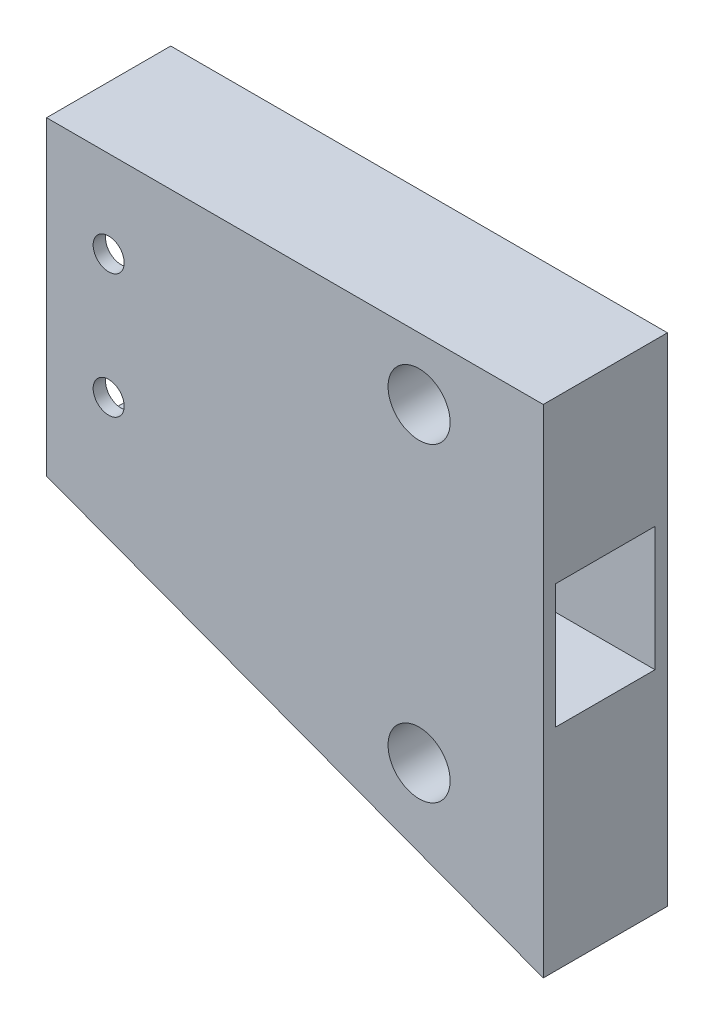
ISO-10303-21;
HEADER;
FILE_DESCRIPTION(('STEP AP214'),'2;1');
FILE_NAME('part.step','',(''),(''),'','','');
FILE_SCHEMA(('AUTOMOTIVE_DESIGN { 1 0 10303 214 1 1 1 1 }'));
ENDSEC;
DATA;
#1=APPLICATION_CONTEXT('core data for automotive mechanical design processes');
#2=APPLICATION_PROTOCOL_DEFINITION('international standard','automotive_design',2000,#1);
#3=PRODUCT_CONTEXT('',#1,'mechanical');
#4=PRODUCT('Part','Part','',(#3));
#5=PRODUCT_RELATED_PRODUCT_CATEGORY('part','',(#4));
#6=PRODUCT_DEFINITION_FORMATION('','',#4);
#7=PRODUCT_DEFINITION_CONTEXT('part definition',#1,'design');
#8=PRODUCT_DEFINITION('design','',#6,#7);
#9=PRODUCT_DEFINITION_SHAPE('','',#8);
#10=(LENGTH_UNIT() NAMED_UNIT(*) SI_UNIT(.MILLI.,.METRE.));
#11=(NAMED_UNIT(*) PLANE_ANGLE_UNIT() SI_UNIT($,.RADIAN.));
#12=(NAMED_UNIT(*) SI_UNIT($,.STERADIAN.) SOLID_ANGLE_UNIT());
#13=UNCERTAINTY_MEASURE_WITH_UNIT(LENGTH_MEASURE(1.E-05),#10,'distance_accuracy_value','');
#14=(GEOMETRIC_REPRESENTATION_CONTEXT(3) GLOBAL_UNCERTAINTY_ASSIGNED_CONTEXT((#13)) GLOBAL_UNIT_ASSIGNED_CONTEXT((#10,
#11,#12)) REPRESENTATION_CONTEXT('',''));
#15=CARTESIAN_POINT('',(0.,0.,0.));
#16=DIRECTION('',(0.,0.,1.));
#17=DIRECTION('',(1.,0.,0.));
#18=AXIS2_PLACEMENT_3D('',#15,#16,#17);
#19=CARTESIAN_POINT('',(0.,25.,10.));
#20=DIRECTION('',(1.,0.,0.));
#21=DIRECTION('',(0.,0.,-1.));
#22=AXIS2_PLACEMENT_3D('',#19,#20,#21);
#23=PLANE('',#22);
#24=DIRECTION('',(0.,0.,1.));
#25=VECTOR('',#24,1.);
#26=CARTESIAN_POINT('',(0.,2.,1.));
#27=LINE('',#26,#25);
#28=CARTESIAN_POINT('',(0.,2.,1.));
#29=VERTEX_POINT('',#28);
#30=CARTESIAN_POINT('',(0.,2.,9.));
#31=VERTEX_POINT('',#30);
#32=EDGE_CURVE('E173',#29,#31,#27,.T.);
#33=ORIENTED_EDGE('',*,*,#32,.F.);
#34=DIRECTION('',(0.,-1.,0.));
#35=VECTOR('',#34,1.);
#36=CARTESIAN_POINT('',(0.,22.,1.));
#37=LINE('',#36,#35);
#38=CARTESIAN_POINT('',(0.,22.,1.));
#39=VERTEX_POINT('',#38);
#40=EDGE_CURVE('E126',#39,#29,#37,.T.);
#41=ORIENTED_EDGE('',*,*,#40,.F.);
#42=DIRECTION('',(0.,0.,-1.));
#43=VECTOR('',#42,1.);
#44=CARTESIAN_POINT('',(0.,22.,1.));
#45=LINE('',#44,#43);
#46=CARTESIAN_POINT('',(0.,22.,9.));
#47=VERTEX_POINT('',#46);
#48=EDGE_CURVE('E165',#47,#39,#45,.T.);
#49=ORIENTED_EDGE('',*,*,#48,.F.);
#50=DIRECTION('',(0.,1.,0.));
#51=VECTOR('',#50,1.);
#52=CARTESIAN_POINT('',(0.,22.,9.));
#53=LINE('',#52,#51);
#54=EDGE_CURVE('E176',#31,#47,#53,.T.);
#55=ORIENTED_EDGE('',*,*,#54,.F.);
#56=EDGE_LOOP('',(#33,#41,#49,#55));
#57=FACE_BOUND('',#56,.T.);
#58=DIRECTION('',(0.,-1.,0.));
#59=VECTOR('',#58,1.);
#60=CARTESIAN_POINT('',(0.,25.,0.));
#61=LINE('',#60,#59);
#62=CARTESIAN_POINT('',(0.,25.,0.));
#63=VERTEX_POINT('',#62);
#64=CARTESIAN_POINT('',(0.,0.,0.));
#65=VERTEX_POINT('',#64);
#66=EDGE_CURVE('E186',#63,#65,#61,.T.);
#67=ORIENTED_EDGE('',*,*,#66,.T.);
#68=DIRECTION('',(0.,0.,-1.));
#69=VECTOR('',#68,1.);
#70=CARTESIAN_POINT('',(0.,0.,10.));
#71=LINE('',#70,#69);
#72=CARTESIAN_POINT('',(0.,0.,10.));
#73=VERTEX_POINT('',#72);
#74=EDGE_CURVE('E11',#73,#65,#71,.T.);
#75=ORIENTED_EDGE('',*,*,#74,.F.);
#76=DIRECTION('',(0.,-1.,0.));
#77=VECTOR('',#76,1.);
#78=CARTESIAN_POINT('',(0.,25.,10.));
#79=LINE('',#78,#77);
#80=CARTESIAN_POINT('',(0.,25.,10.));
#81=VERTEX_POINT('',#80);
#82=EDGE_CURVE('E192',#81,#73,#79,.T.);
#83=ORIENTED_EDGE('',*,*,#82,.F.);
#84=DIRECTION('',(0.,0.,-1.));
#85=VECTOR('',#84,1.);
#86=CARTESIAN_POINT('',(0.,25.,10.));
#87=LINE('',#86,#85);
#88=EDGE_CURVE('E206',#81,#63,#87,.T.);
#89=ORIENTED_EDGE('',*,*,#88,.T.);
#90=EDGE_LOOP('',(#67,#75,#83,#89));
#91=FACE_BOUND('',#90,.T.);
#92=ADVANCED_FACE('F39',(#57,#91),#23,.F.);
#93=CARTESIAN_POINT('',(0.,0.,10.));
#94=DIRECTION('',(0.351123441588392,0.936329177569045,0.));
#95=DIRECTION('',(-0.936329177569045,0.351123441588392,0.));
#96=AXIS2_PLACEMENT_3D('',#93,#94,#95);
#97=PLANE('',#96);
#98=DIRECTION('',(0.936329177569045,-0.351123441588392,0.));
#99=VECTOR('',#98,1.);
#100=CARTESIAN_POINT('',(0.,0.,0.));
#101=LINE('',#100,#99);
#102=CARTESIAN_POINT('',(40.,-15.,0.));
#103=VERTEX_POINT('',#102);
#104=EDGE_CURVE('E210',#65,#103,#101,.T.);
#105=ORIENTED_EDGE('',*,*,#104,.T.);
#106=DIRECTION('',(0.,0.,-1.));
#107=VECTOR('',#106,1.);
#108=CARTESIAN_POINT('',(40.,-15.,10.));
#109=LINE('',#108,#107);
#110=CARTESIAN_POINT('',(40.,-15.,10.));
#111=VERTEX_POINT('',#110);
#112=EDGE_CURVE('E48',#111,#103,#109,.T.);
#113=ORIENTED_EDGE('',*,*,#112,.F.);
#114=DIRECTION('',(0.936329177569045,-0.351123441588392,0.));
#115=VECTOR('',#114,1.);
#116=CARTESIAN_POINT('',(0.,0.,10.));
#117=LINE('',#116,#115);
#118=EDGE_CURVE('E196',#73,#111,#117,.T.);
#119=ORIENTED_EDGE('',*,*,#118,.F.);
#120=ORIENTED_EDGE('',*,*,#74,.T.);
#121=EDGE_LOOP('',(#105,#113,#119,#120));
#122=FACE_BOUND('',#121,.T.);
#123=ADVANCED_FACE('F291',(#122),#97,.F.);
#124=CARTESIAN_POINT('',(40.,-15.,10.));
#125=DIRECTION('',(-1.,0.,0.));
#126=DIRECTION('',(0.,0.,1.));
#127=AXIS2_PLACEMENT_3D('',#124,#125,#126);
#128=PLANE('',#127);
#129=DIRECTION('',(0.,0.,-1.));
#130=VECTOR('',#129,1.);
#131=CARTESIAN_POINT('',(40.,12.,1.));
#132=LINE('',#131,#130);
#133=CARTESIAN_POINT('',(40.,12.,9.));
#134=VERTEX_POINT('',#133);
#135=CARTESIAN_POINT('',(40.,12.,1.));
#136=VERTEX_POINT('',#135);
#137=EDGE_CURVE('E141',#134,#136,#132,.T.);
#138=ORIENTED_EDGE('',*,*,#137,.T.);
#139=DIRECTION('',(0.,-1.,0.));
#140=VECTOR('',#139,1.);
#141=CARTESIAN_POINT('',(40.,2.,1.));
#142=LINE('',#141,#140);
#143=CARTESIAN_POINT('',(40.,2.,1.));
#144=VERTEX_POINT('',#143);
#145=EDGE_CURVE('E123',#136,#144,#142,.T.);
#146=ORIENTED_EDGE('',*,*,#145,.T.);
#147=DIRECTION('',(0.,0.,1.));
#148=VECTOR('',#147,1.);
#149=CARTESIAN_POINT('',(40.,2.,1.));
#150=LINE('',#149,#148);
#151=CARTESIAN_POINT('',(40.,2.,9.));
#152=VERTEX_POINT('',#151);
#153=EDGE_CURVE('E132',#144,#152,#150,.T.);
#154=ORIENTED_EDGE('',*,*,#153,.T.);
#155=DIRECTION('',(0.,1.,0.));
#156=VECTOR('',#155,1.);
#157=CARTESIAN_POINT('',(40.,2.,9.));
#158=LINE('',#157,#156);
#159=EDGE_CURVE('E137',#152,#134,#158,.T.);
#160=ORIENTED_EDGE('',*,*,#159,.T.);
#161=EDGE_LOOP('',(#138,#146,#154,#160));
#162=FACE_BOUND('',#161,.T.);
#163=DIRECTION('',(0.,1.,0.));
#164=VECTOR('',#163,1.);
#165=CARTESIAN_POINT('',(40.,-15.,0.));
#166=LINE('',#165,#164);
#167=CARTESIAN_POINT('',(40.,25.,0.));
#168=VERTEX_POINT('',#167);
#169=EDGE_CURVE('E213',#103,#168,#166,.T.);
#170=ORIENTED_EDGE('',*,*,#169,.T.);
#171=DIRECTION('',(0.,0.,-1.));
#172=VECTOR('',#171,1.);
#173=CARTESIAN_POINT('',(40.,25.,10.));
#174=LINE('',#173,#172);
#175=CARTESIAN_POINT('',(40.,25.,10.));
#176=VERTEX_POINT('',#175);
#177=EDGE_CURVE('E221',#176,#168,#174,.T.);
#178=ORIENTED_EDGE('',*,*,#177,.F.);
#179=DIRECTION('',(0.,1.,0.));
#180=VECTOR('',#179,1.);
#181=CARTESIAN_POINT('',(40.,-15.,10.));
#182=LINE('',#181,#180);
#183=EDGE_CURVE('E200',#111,#176,#182,.T.);
#184=ORIENTED_EDGE('',*,*,#183,.F.);
#185=ORIENTED_EDGE('',*,*,#112,.T.);
#186=EDGE_LOOP('',(#170,#178,#184,#185));
#187=FACE_BOUND('',#186,.T.);
#188=ADVANCED_FACE('F139',(#162,#187),#128,.F.);
#189=CARTESIAN_POINT('',(40.,25.,10.));
#190=DIRECTION('',(0.,-1.,0.));
#191=DIRECTION('',(0.,0.,-1.));
#192=AXIS2_PLACEMENT_3D('',#189,#190,#191);
#193=PLANE('',#192);
#194=DIRECTION('',(-1.,0.,0.));
#195=VECTOR('',#194,1.);
#196=CARTESIAN_POINT('',(40.,25.,0.));
#197=LINE('',#196,#195);
#198=EDGE_CURVE('E197',#168,#63,#197,.T.);
#199=ORIENTED_EDGE('',*,*,#198,.T.);
#200=ORIENTED_EDGE('',*,*,#88,.F.);
#201=DIRECTION('',(-1.,0.,0.));
#202=VECTOR('',#201,1.);
#203=CARTESIAN_POINT('',(40.,25.,10.));
#204=LINE('',#203,#202);
#205=EDGE_CURVE('E203',#176,#81,#204,.T.);
#206=ORIENTED_EDGE('',*,*,#205,.F.);
#207=ORIENTED_EDGE('',*,*,#177,.T.);
#208=EDGE_LOOP('',(#199,#200,#206,#207));
#209=FACE_BOUND('',#208,.T.);
#210=ADVANCED_FACE('F278',(#209),#193,.F.);
#211=CARTESIAN_POINT('',(0.,0.,10.));
#212=DIRECTION('',(0.,0.,-1.));
#213=DIRECTION('',(-1.,0.,0.));
#214=AXIS2_PLACEMENT_3D('',#211,#212,#213);
#215=PLANE('',#214);
#216=CARTESIAN_POINT('',(30.0000000000003,-5.,10.));
#217=DIRECTION('',(0.,0.,1.));
#218=DIRECTION('',(1.,0.,0.));
#219=AXIS2_PLACEMENT_3D('',#216,#217,#218);
#220=CIRCLE('',#219,2.50000000000001);
#221=CARTESIAN_POINT('',(32.5000000000003,-5.,10.));
#222=VERTEX_POINT('',#221);
#223=EDGE_CURVE('E251',#222,#222,#220,.T.);
#224=ORIENTED_EDGE('',*,*,#223,.F.);
#225=EDGE_LOOP('',(#224));
#226=FACE_BOUND('',#225,.T.);
#227=CARTESIAN_POINT('',(30.,20.,10.));
#228=DIRECTION('',(0.,0.,1.));
#229=DIRECTION('',(1.,0.,0.));
#230=AXIS2_PLACEMENT_3D('',#227,#228,#229);
#231=CIRCLE('',#230,2.5);
#232=CARTESIAN_POINT('',(32.5,20.,10.));
#233=VERTEX_POINT('',#232);
#234=EDGE_CURVE('E259',#233,#233,#231,.T.);
#235=ORIENTED_EDGE('',*,*,#234,.F.);
#236=EDGE_LOOP('',(#235));
#237=FACE_BOUND('',#236,.T.);
#238=CARTESIAN_POINT('',(5.,8.,10.));
#239=DIRECTION('',(0.,0.,1.));
#240=DIRECTION('',(1.,0.,0.));
#241=AXIS2_PLACEMENT_3D('',#238,#239,#240);
#242=CIRCLE('',#241,1.25);
#243=CARTESIAN_POINT('',(6.25,8.,10.));
#244=VERTEX_POINT('',#243);
#245=EDGE_CURVE('E244',#244,#244,#242,.T.);
#246=ORIENTED_EDGE('',*,*,#245,.F.);
#247=EDGE_LOOP('',(#246));
#248=FACE_BOUND('',#247,.T.);
#249=CARTESIAN_POINT('',(5.,18.,10.));
#250=DIRECTION('',(0.,0.,1.));
#251=DIRECTION('',(1.,0.,0.));
#252=AXIS2_PLACEMENT_3D('',#249,#250,#251);
#253=CIRCLE('',#252,1.25);
#254=CARTESIAN_POINT('',(6.25,18.,10.));
#255=VERTEX_POINT('',#254);
#256=EDGE_CURVE('E238',#255,#255,#253,.T.);
#257=ORIENTED_EDGE('',*,*,#256,.F.);
#258=EDGE_LOOP('',(#257));
#259=FACE_BOUND('',#258,.T.);
#260=ORIENTED_EDGE('',*,*,#82,.T.);
#261=ORIENTED_EDGE('',*,*,#118,.T.);
#262=ORIENTED_EDGE('',*,*,#183,.T.);
#263=ORIENTED_EDGE('',*,*,#205,.T.);
#264=EDGE_LOOP('',(#260,#261,#262,#263));
#265=FACE_BOUND('',#264,.T.);
#266=ADVANCED_FACE('F274',(#226,#237,#248,#259,#265),#215,.F.);
#267=CARTESIAN_POINT('',(0.,0.,0.));
#268=DIRECTION('',(0.,0.,-1.));
#269=DIRECTION('',(-1.,0.,0.));
#270=AXIS2_PLACEMENT_3D('',#267,#268,#269);
#271=PLANE('',#270);
#272=CARTESIAN_POINT('',(30.0000000000003,-5.,0.));
#273=DIRECTION('',(0.,0.,1.));
#274=DIRECTION('',(1.,0.,0.));
#275=AXIS2_PLACEMENT_3D('',#272,#273,#274);
#276=CIRCLE('',#275,2.50000000000001);
#277=CARTESIAN_POINT('',(32.5000000000003,-5.,0.));
#278=VERTEX_POINT('',#277);
#279=EDGE_CURVE('E247',#278,#278,#276,.T.);
#280=ORIENTED_EDGE('',*,*,#279,.T.);
#281=EDGE_LOOP('',(#280));
#282=FACE_BOUND('',#281,.T.);
#283=CARTESIAN_POINT('',(30.,20.,0.));
#284=DIRECTION('',(0.,0.,1.));
#285=DIRECTION('',(1.,0.,0.));
#286=AXIS2_PLACEMENT_3D('',#283,#284,#285);
#287=CIRCLE('',#286,2.5);
#288=CARTESIAN_POINT('',(32.5,20.,0.));
#289=VERTEX_POINT('',#288);
#290=EDGE_CURVE('E255',#289,#289,#287,.T.);
#291=ORIENTED_EDGE('',*,*,#290,.T.);
#292=EDGE_LOOP('',(#291));
#293=FACE_BOUND('',#292,.T.);
#294=CARTESIAN_POINT('',(5.,8.,0.));
#295=DIRECTION('',(0.,0.,1.));
#296=DIRECTION('',(1.,0.,0.));
#297=AXIS2_PLACEMENT_3D('',#294,#295,#296);
#298=CIRCLE('',#297,1.25);
#299=CARTESIAN_POINT('',(6.25,8.,0.));
#300=VERTEX_POINT('',#299);
#301=EDGE_CURVE('E263',#300,#300,#298,.T.);
#302=ORIENTED_EDGE('',*,*,#301,.T.);
#303=EDGE_LOOP('',(#302));
#304=FACE_BOUND('',#303,.T.);
#305=CARTESIAN_POINT('',(5.,18.,0.));
#306=DIRECTION('',(0.,0.,1.));
#307=DIRECTION('',(1.,0.,0.));
#308=AXIS2_PLACEMENT_3D('',#305,#306,#307);
#309=CIRCLE('',#308,1.25);
#310=CARTESIAN_POINT('',(6.25,18.,0.));
#311=VERTEX_POINT('',#310);
#312=EDGE_CURVE('E231',#311,#311,#309,.T.);
#313=ORIENTED_EDGE('',*,*,#312,.T.);
#314=EDGE_LOOP('',(#313));
#315=FACE_BOUND('',#314,.T.);
#316=ORIENTED_EDGE('',*,*,#66,.F.);
#317=ORIENTED_EDGE('',*,*,#198,.F.);
#318=ORIENTED_EDGE('',*,*,#169,.F.);
#319=ORIENTED_EDGE('',*,*,#104,.F.);
#320=EDGE_LOOP('',(#316,#317,#318,#319));
#321=FACE_BOUND('',#320,.T.);
#322=ADVANCED_FACE('F277',(#282,#293,#304,#315,#321),#271,.T.);
#323=CARTESIAN_POINT('',(20.,22.,1.));
#324=DIRECTION('',(0.,0.,-1.));
#325=DIRECTION('',(0.,1.,0.));
#326=AXIS2_PLACEMENT_3D('',#323,#324,#325);
#327=PLANE('',#326);
#328=CARTESIAN_POINT('',(5.,8.,1.));
#329=DIRECTION('',(0.,0.,-1.));
#330=DIRECTION('',(0.,1.,0.));
#331=AXIS2_PLACEMENT_3D('',#328,#329,#330);
#332=CIRCLE('',#331,1.25);
#333=CARTESIAN_POINT('',(5.,9.25,1.));
#334=VERTEX_POINT('',#333);
#335=EDGE_CURVE('E146',#334,#334,#332,.T.);
#336=ORIENTED_EDGE('',*,*,#335,.T.);
#337=EDGE_LOOP('',(#336));
#338=FACE_BOUND('',#337,.T.);
#339=CARTESIAN_POINT('',(5.,18.,1.));
#340=DIRECTION('',(0.,0.,-1.));
#341=DIRECTION('',(0.,1.,0.));
#342=AXIS2_PLACEMENT_3D('',#339,#340,#341);
#343=CIRCLE('',#342,1.25);
#344=CARTESIAN_POINT('',(5.,19.25,1.));
#345=VERTEX_POINT('',#344);
#346=EDGE_CURVE('E230',#345,#345,#343,.T.);
#347=ORIENTED_EDGE('',*,*,#346,.T.);
#348=EDGE_LOOP('',(#347));
#349=FACE_BOUND('',#348,.T.);
#350=ORIENTED_EDGE('',*,*,#40,.T.);
#351=DIRECTION('',(-1.,0.,0.));
#352=VECTOR('',#351,1.);
#353=CARTESIAN_POINT('',(20.,2.,1.));
#354=LINE('',#353,#352);
#355=EDGE_CURVE('E120',#144,#29,#354,.T.);
#356=ORIENTED_EDGE('',*,*,#355,.F.);
#357=ORIENTED_EDGE('',*,*,#145,.F.);
#358=DIRECTION('',(-1.,0.,0.));
#359=VECTOR('',#358,1.);
#360=CARTESIAN_POINT('',(40.,12.,1.));
#361=LINE('',#360,#359);
#362=CARTESIAN_POINT('',(20.,12.,1.));
#363=VERTEX_POINT('',#362);
#364=EDGE_CURVE('E155',#136,#363,#361,.T.);
#365=ORIENTED_EDGE('',*,*,#364,.T.);
#366=DIRECTION('',(0.,-1.,0.));
#367=VECTOR('',#366,1.);
#368=CARTESIAN_POINT('',(20.,22.,1.));
#369=LINE('',#368,#367);
#370=CARTESIAN_POINT('',(20.,22.,1.));
#371=VERTEX_POINT('',#370);
#372=EDGE_CURVE('E160',#371,#363,#369,.T.);
#373=ORIENTED_EDGE('',*,*,#372,.F.);
#374=DIRECTION('',(-1.,0.,0.));
#375=VECTOR('',#374,1.);
#376=CARTESIAN_POINT('',(20.,22.,1.));
#377=LINE('',#376,#375);
#378=EDGE_CURVE('E183',#371,#39,#377,.T.);
#379=ORIENTED_EDGE('',*,*,#378,.T.);
#380=EDGE_LOOP('',(#350,#356,#357,#365,#373,#379));
#381=FACE_BOUND('',#380,.T.);
#382=ADVANCED_FACE('F121',(#338,#349,#381),#327,.F.);
#383=CARTESIAN_POINT('',(20.,22.,1.));
#384=DIRECTION('',(0.,1.,0.));
#385=DIRECTION('',(0.,0.,1.));
#386=AXIS2_PLACEMENT_3D('',#383,#384,#385);
#387=PLANE('',#386);
#388=ORIENTED_EDGE('',*,*,#48,.T.);
#389=ORIENTED_EDGE('',*,*,#378,.F.);
#390=DIRECTION('',(0.,0.,-1.));
#391=VECTOR('',#390,1.);
#392=CARTESIAN_POINT('',(20.,22.,1.));
#393=LINE('',#392,#391);
#394=CARTESIAN_POINT('',(20.,22.,9.));
#395=VERTEX_POINT('',#394);
#396=EDGE_CURVE('E129',#395,#371,#393,.T.);
#397=ORIENTED_EDGE('',*,*,#396,.F.);
#398=DIRECTION('',(-1.,0.,0.));
#399=VECTOR('',#398,1.);
#400=CARTESIAN_POINT('',(20.,22.,9.));
#401=LINE('',#400,#399);
#402=EDGE_CURVE('E187',#395,#47,#401,.T.);
#403=ORIENTED_EDGE('',*,*,#402,.T.);
#404=EDGE_LOOP('',(#388,#389,#397,#403));
#405=FACE_BOUND('',#404,.T.);
#406=ADVANCED_FACE('F304',(#405),#387,.F.);
#407=CARTESIAN_POINT('',(20.,22.,9.));
#408=DIRECTION('',(0.,0.,1.));
#409=DIRECTION('',(1.,0.,0.));
#410=AXIS2_PLACEMENT_3D('',#407,#408,#409);
#411=PLANE('',#410);
#412=CARTESIAN_POINT('',(5.,8.,9.));
#413=DIRECTION('',(0.,0.,1.));
#414=DIRECTION('',(1.,0.,0.));
#415=AXIS2_PLACEMENT_3D('',#412,#413,#414);
#416=CIRCLE('',#415,1.25);
#417=CARTESIAN_POINT('',(6.25,8.,9.));
#418=VERTEX_POINT('',#417);
#419=EDGE_CURVE('E42',#418,#418,#416,.T.);
#420=ORIENTED_EDGE('',*,*,#419,.T.);
#421=EDGE_LOOP('',(#420));
#422=FACE_BOUND('',#421,.T.);
#423=CARTESIAN_POINT('',(5.,18.,9.));
#424=DIRECTION('',(0.,0.,1.));
#425=DIRECTION('',(1.,0.,0.));
#426=AXIS2_PLACEMENT_3D('',#423,#424,#425);
#427=CIRCLE('',#426,1.25);
#428=CARTESIAN_POINT('',(6.25,18.,9.));
#429=VERTEX_POINT('',#428);
#430=EDGE_CURVE('E227',#429,#429,#427,.T.);
#431=ORIENTED_EDGE('',*,*,#430,.T.);
#432=EDGE_LOOP('',(#431));
#433=FACE_BOUND('',#432,.T.);
#434=ORIENTED_EDGE('',*,*,#54,.T.);
#435=ORIENTED_EDGE('',*,*,#402,.F.);
#436=DIRECTION('',(0.,1.,0.));
#437=VECTOR('',#436,1.);
#438=CARTESIAN_POINT('',(20.,22.,9.));
#439=LINE('',#438,#437);
#440=CARTESIAN_POINT('',(20.,12.,9.));
#441=VERTEX_POINT('',#440);
#442=EDGE_CURVE('E164',#441,#395,#439,.T.);
#443=ORIENTED_EDGE('',*,*,#442,.F.);
#444=DIRECTION('',(-1.,0.,0.));
#445=VECTOR('',#444,1.);
#446=CARTESIAN_POINT('',(40.,12.,9.));
#447=LINE('',#446,#445);
#448=EDGE_CURVE('E56',#134,#441,#447,.T.);
#449=ORIENTED_EDGE('',*,*,#448,.F.);
#450=ORIENTED_EDGE('',*,*,#159,.F.);
#451=DIRECTION('',(-1.,0.,0.));
#452=VECTOR('',#451,1.);
#453=CARTESIAN_POINT('',(20.,2.,9.));
#454=LINE('',#453,#452);
#455=EDGE_CURVE('E64',#152,#31,#454,.T.);
#456=ORIENTED_EDGE('',*,*,#455,.T.);
#457=EDGE_LOOP('',(#434,#435,#443,#449,#450,#456));
#458=FACE_BOUND('',#457,.T.);
#459=ADVANCED_FACE('F318',(#422,#433,#458),#411,.F.);
#460=CARTESIAN_POINT('',(20.,2.,1.));
#461=DIRECTION('',(0.,-1.,0.));
#462=DIRECTION('',(0.,0.,-1.));
#463=AXIS2_PLACEMENT_3D('',#460,#461,#462);
#464=PLANE('',#463);
#465=ORIENTED_EDGE('',*,*,#32,.T.);
#466=ORIENTED_EDGE('',*,*,#455,.F.);
#467=ORIENTED_EDGE('',*,*,#153,.F.);
#468=ORIENTED_EDGE('',*,*,#355,.T.);
#469=EDGE_LOOP('',(#465,#466,#467,#468));
#470=FACE_BOUND('',#469,.T.);
#471=ADVANCED_FACE('F133',(#470),#464,.F.);
#472=CARTESIAN_POINT('',(20.,0.,0.));
#473=DIRECTION('',(-1.,0.,0.));
#474=DIRECTION('',(0.,0.,1.));
#475=AXIS2_PLACEMENT_3D('',#472,#473,#474);
#476=PLANE('',#475);
#477=DIRECTION('',(0.,0.,-1.));
#478=VECTOR('',#477,1.);
#479=CARTESIAN_POINT('',(20.,12.,1.));
#480=LINE('',#479,#478);
#481=EDGE_CURVE('E143',#441,#363,#480,.T.);
#482=ORIENTED_EDGE('',*,*,#481,.F.);
#483=ORIENTED_EDGE('',*,*,#442,.T.);
#484=ORIENTED_EDGE('',*,*,#396,.T.);
#485=ORIENTED_EDGE('',*,*,#372,.T.);
#486=EDGE_LOOP('',(#482,#483,#484,#485));
#487=FACE_BOUND('',#486,.T.);
#488=ADVANCED_FACE('F324',(#487),#476,.T.);
#489=CARTESIAN_POINT('',(40.,12.,1.));
#490=DIRECTION('',(0.,1.,0.));
#491=DIRECTION('',(0.,0.,1.));
#492=AXIS2_PLACEMENT_3D('',#489,#490,#491);
#493=PLANE('',#492);
#494=ORIENTED_EDGE('',*,*,#481,.T.);
#495=ORIENTED_EDGE('',*,*,#364,.F.);
#496=ORIENTED_EDGE('',*,*,#137,.F.);
#497=ORIENTED_EDGE('',*,*,#448,.T.);
#498=EDGE_LOOP('',(#494,#495,#496,#497));
#499=FACE_BOUND('',#498,.T.);
#500=ADVANCED_FACE('F321',(#499),#493,.F.);
#501=CARTESIAN_POINT('',(5.,18.,0.));
#502=DIRECTION('',(0.,0.,1.));
#503=DIRECTION('',(1.,0.,0.));
#504=AXIS2_PLACEMENT_3D('',#501,#502,#503);
#505=CYLINDRICAL_SURFACE('',#504,1.25);
#506=ORIENTED_EDGE('',*,*,#256,.T.);
#507=EDGE_LOOP('',(#506));
#508=FACE_BOUND('',#507,.T.);
#509=ORIENTED_EDGE('',*,*,#430,.F.);
#510=EDGE_LOOP('',(#509));
#511=FACE_BOUND('',#510,.T.);
#512=ADVANCED_FACE('F343',(#508,#511),#505,.F.);
#513=CARTESIAN_POINT('',(5.,8.,0.));
#514=DIRECTION('',(0.,0.,1.));
#515=DIRECTION('',(1.,0.,0.));
#516=AXIS2_PLACEMENT_3D('',#513,#514,#515);
#517=CYLINDRICAL_SURFACE('',#516,1.25);
#518=ORIENTED_EDGE('',*,*,#245,.T.);
#519=EDGE_LOOP('',(#518));
#520=FACE_BOUND('',#519,.T.);
#521=ORIENTED_EDGE('',*,*,#419,.F.);
#522=EDGE_LOOP('',(#521));
#523=FACE_BOUND('',#522,.T.);
#524=ADVANCED_FACE('F271',(#520,#523),#517,.F.);
#525=ORIENTED_EDGE('',*,*,#312,.F.);
#526=EDGE_LOOP('',(#525));
#527=FACE_BOUND('',#526,.T.);
#528=ORIENTED_EDGE('',*,*,#346,.F.);
#529=EDGE_LOOP('',(#528));
#530=FACE_BOUND('',#529,.T.);
#531=ADVANCED_FACE('F349',(#527,#530),#505,.F.);
#532=ORIENTED_EDGE('',*,*,#301,.F.);
#533=EDGE_LOOP('',(#532));
#534=FACE_BOUND('',#533,.T.);
#535=ORIENTED_EDGE('',*,*,#335,.F.);
#536=EDGE_LOOP('',(#535));
#537=FACE_BOUND('',#536,.T.);
#538=ADVANCED_FACE('F352',(#534,#537),#517,.F.);
#539=CARTESIAN_POINT('',(30.,20.,0.));
#540=DIRECTION('',(0.,0.,1.));
#541=DIRECTION('',(1.,0.,0.));
#542=AXIS2_PLACEMENT_3D('',#539,#540,#541);
#543=CYLINDRICAL_SURFACE('',#542,2.5);
#544=ORIENTED_EDGE('',*,*,#290,.F.);
#545=EDGE_LOOP('',(#544));
#546=FACE_BOUND('',#545,.T.);
#547=ORIENTED_EDGE('',*,*,#234,.T.);
#548=EDGE_LOOP('',(#547));
#549=FACE_BOUND('',#548,.T.);
#550=ADVANCED_FACE('F357',(#546,#549),#543,.F.);
#551=CARTESIAN_POINT('',(30.0000000000003,-5.,0.));
#552=DIRECTION('',(0.,0.,1.));
#553=DIRECTION('',(1.,0.,0.));
#554=AXIS2_PLACEMENT_3D('',#551,#552,#553);
#555=CYLINDRICAL_SURFACE('',#554,2.50000000000001);
#556=ORIENTED_EDGE('',*,*,#279,.F.);
#557=EDGE_LOOP('',(#556));
#558=FACE_BOUND('',#557,.T.);
#559=ORIENTED_EDGE('',*,*,#223,.T.);
#560=EDGE_LOOP('',(#559));
#561=FACE_BOUND('',#560,.T.);
#562=ADVANCED_FACE('F354',(#558,#561),#555,.F.);
#563=CLOSED_SHELL('',(#92,#123,#188,#210,#266,#322,#382,#406,#459,#471,#488,#500,#512,#524,#531,
#538,#550,#562));
#564=MANIFOLD_SOLID_BREP('B2',#563);
#565=ADVANCED_BREP_SHAPE_REPRESENTATION('',(#18,#564),#14);
#566=SHAPE_DEFINITION_REPRESENTATION(#9,#565);
ENDSEC;
END-ISO-10303-21;
